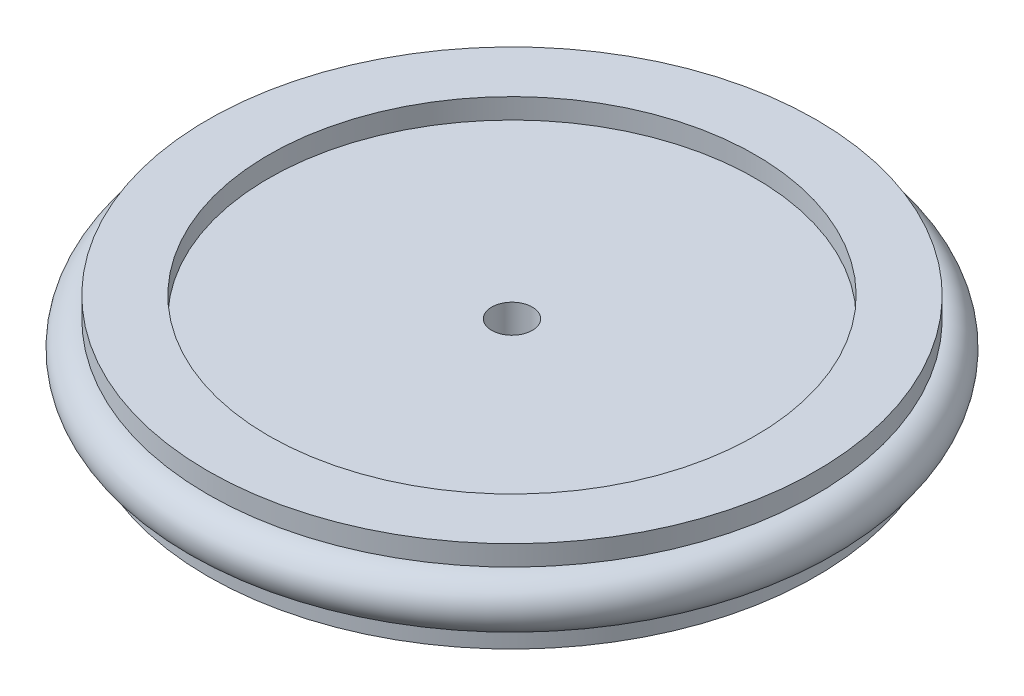
ISO-10303-21;
HEADER;
FILE_DESCRIPTION(('STEP AP214'),'2;1');
FILE_NAME('part.step','',(''),(''),'','','');
FILE_SCHEMA(('AUTOMOTIVE_DESIGN { 1 0 10303 214 1 1 1 1 }'));
ENDSEC;
DATA;
#1=APPLICATION_CONTEXT('core data for automotive mechanical design processes');
#2=APPLICATION_PROTOCOL_DEFINITION('international standard','automotive_design',2000,#1);
#3=PRODUCT_CONTEXT('',#1,'mechanical');
#4=PRODUCT('Part','Part','',(#3));
#5=PRODUCT_RELATED_PRODUCT_CATEGORY('part','',(#4));
#6=PRODUCT_DEFINITION_FORMATION('','',#4);
#7=PRODUCT_DEFINITION_CONTEXT('part definition',#1,'design');
#8=PRODUCT_DEFINITION('design','',#6,#7);
#9=PRODUCT_DEFINITION_SHAPE('','',#8);
#10=(LENGTH_UNIT() NAMED_UNIT(*) SI_UNIT(.MILLI.,.METRE.));
#11=(NAMED_UNIT(*) PLANE_ANGLE_UNIT() SI_UNIT($,.RADIAN.));
#12=(NAMED_UNIT(*) SI_UNIT($,.STERADIAN.) SOLID_ANGLE_UNIT());
#13=UNCERTAINTY_MEASURE_WITH_UNIT(LENGTH_MEASURE(1.E-05),#10,'distance_accuracy_value','');
#14=(GEOMETRIC_REPRESENTATION_CONTEXT(3) GLOBAL_UNCERTAINTY_ASSIGNED_CONTEXT((#13)) GLOBAL_UNIT_ASSIGNED_CONTEXT((#10,
#11,#12)) REPRESENTATION_CONTEXT('',''));
#15=CARTESIAN_POINT('',(0.,0.,0.));
#16=DIRECTION('',(0.,0.,1.));
#17=DIRECTION('',(1.,0.,0.));
#18=AXIS2_PLACEMENT_3D('',#15,#16,#17);
#19=CARTESIAN_POINT('',(1.,-2.,0.));
#20=DIRECTION('',(0.,1.,0.));
#21=DIRECTION('',(0.,0.,1.));
#22=AXIS2_PLACEMENT_3D('',#19,#20,#21);
#23=PLANE('',#22);
#24=CARTESIAN_POINT('',(0.,-2.,0.));
#25=DIRECTION('',(0.,1.,0.));
#26=DIRECTION('',(0.,0.,1.));
#27=AXIS2_PLACEMENT_3D('',#24,#25,#26);
#28=CIRCLE('',#27,3.);
#29=CARTESIAN_POINT('',(0.,-2.,3.));
#30=VERTEX_POINT('',#29);
#31=EDGE_CURVE('E10',#30,#30,#28,.T.);
#32=ORIENTED_EDGE('',*,*,#31,.F.);
#33=EDGE_LOOP('',(#32));
#34=FACE_BOUND('',#33,.T.);
#35=CARTESIAN_POINT('',(0.,-2.,0.));
#36=DIRECTION('',(0.,1.,0.));
#37=DIRECTION('',(0.,0.,1.));
#38=AXIS2_PLACEMENT_3D('',#35,#36,#37);
#39=CIRCLE('',#38,1.);
#40=CARTESIAN_POINT('',(0.,-2.,1.));
#41=VERTEX_POINT('',#40);
#42=EDGE_CURVE('E73',#41,#41,#39,.T.);
#43=ORIENTED_EDGE('',*,*,#42,.T.);
#44=EDGE_LOOP('',(#43));
#45=FACE_BOUND('',#44,.T.);
#46=ADVANCED_FACE('F33',(#34,#45),#23,.F.);
#47=CARTESIAN_POINT('',(0.,26.3538012690022,0.));
#48=DIRECTION('',(0.,1.,0.));
#49=DIRECTION('',(0.,0.,1.));
#50=AXIS2_PLACEMENT_3D('',#47,#48,#49);
#51=CYLINDRICAL_SURFACE('',#50,3.);
#52=CARTESIAN_POINT('',(0.,0.,0.));
#53=DIRECTION('',(0.,1.,0.));
#54=DIRECTION('',(0.,0.,1.));
#55=AXIS2_PLACEMENT_3D('',#52,#53,#54);
#56=CIRCLE('',#55,3.);
#57=CARTESIAN_POINT('',(0.,0.,3.));
#58=VERTEX_POINT('',#57);
#59=EDGE_CURVE('E39',#58,#58,#56,.T.);
#60=ORIENTED_EDGE('',*,*,#59,.F.);
#61=EDGE_LOOP('',(#60));
#62=FACE_BOUND('',#61,.T.);
#63=ORIENTED_EDGE('',*,*,#31,.T.);
#64=EDGE_LOOP('',(#63));
#65=FACE_BOUND('',#64,.T.);
#66=ADVANCED_FACE('F134',(#62,#65),#51,.T.);
#67=CARTESIAN_POINT('',(3.,0.,0.));
#68=DIRECTION('',(0.,1.,0.));
#69=DIRECTION('',(0.,0.,1.));
#70=AXIS2_PLACEMENT_3D('',#67,#68,#69);
#71=PLANE('',#70);
#72=CARTESIAN_POINT('',(0.,0.,0.));
#73=DIRECTION('',(0.,1.,0.));
#74=DIRECTION('',(0.,0.,1.));
#75=AXIS2_PLACEMENT_3D('',#72,#73,#74);
#76=CIRCLE('',#75,12.);
#77=CARTESIAN_POINT('',(0.,0.,12.));
#78=VERTEX_POINT('',#77);
#79=EDGE_CURVE('E43',#78,#78,#76,.T.);
#80=ORIENTED_EDGE('',*,*,#79,.F.);
#81=EDGE_LOOP('',(#80));
#82=FACE_BOUND('',#81,.T.);
#83=ORIENTED_EDGE('',*,*,#59,.T.);
#84=EDGE_LOOP('',(#83));
#85=FACE_BOUND('',#84,.T.);
#86=ADVANCED_FACE('F129',(#82,#85),#71,.F.);
#87=CARTESIAN_POINT('',(0.,26.3538012690022,0.));
#88=DIRECTION('',(0.,1.,0.));
#89=DIRECTION('',(0.,0.,1.));
#90=AXIS2_PLACEMENT_3D('',#87,#88,#89);
#91=CYLINDRICAL_SURFACE('',#90,12.);
#92=CARTESIAN_POINT('',(0.,-1.,0.));
#93=DIRECTION('',(0.,1.,0.));
#94=DIRECTION('',(0.,0.,1.));
#95=AXIS2_PLACEMENT_3D('',#92,#93,#94);
#96=CIRCLE('',#95,12.);
#97=CARTESIAN_POINT('',(0.,-1.,12.));
#98=VERTEX_POINT('',#97);
#99=EDGE_CURVE('E47',#98,#98,#96,.T.);
#100=ORIENTED_EDGE('',*,*,#99,.F.);
#101=EDGE_LOOP('',(#100));
#102=FACE_BOUND('',#101,.T.);
#103=ORIENTED_EDGE('',*,*,#79,.T.);
#104=EDGE_LOOP('',(#103));
#105=FACE_BOUND('',#104,.T.);
#106=ADVANCED_FACE('F123',(#102,#105),#91,.F.);
#107=CARTESIAN_POINT('',(12.,-1.,0.));
#108=DIRECTION('',(0.,1.,0.));
#109=DIRECTION('',(0.,0.,1.));
#110=AXIS2_PLACEMENT_3D('',#107,#108,#109);
#111=PLANE('',#110);
#112=CARTESIAN_POINT('',(0.,-1.,0.));
#113=DIRECTION('',(0.,1.,0.));
#114=DIRECTION('',(0.,0.,1.));
#115=AXIS2_PLACEMENT_3D('',#112,#113,#114);
#116=CIRCLE('',#115,15.);
#117=CARTESIAN_POINT('',(0.,-1.,15.));
#118=VERTEX_POINT('',#117);
#119=EDGE_CURVE('E52',#118,#118,#116,.T.);
#120=ORIENTED_EDGE('',*,*,#119,.F.);
#121=EDGE_LOOP('',(#120));
#122=FACE_BOUND('',#121,.T.);
#123=ORIENTED_EDGE('',*,*,#99,.T.);
#124=EDGE_LOOP('',(#123));
#125=FACE_BOUND('',#124,.T.);
#126=ADVANCED_FACE('F117',(#122,#125),#111,.F.);
#127=CARTESIAN_POINT('',(0.,26.3538012690022,0.));
#128=DIRECTION('',(0.,1.,0.));
#129=DIRECTION('',(0.,0.,1.));
#130=AXIS2_PLACEMENT_3D('',#127,#128,#129);
#131=CYLINDRICAL_SURFACE('',#130,15.);
#132=CARTESIAN_POINT('',(0.,0.,0.));
#133=DIRECTION('',(0.,1.,0.));
#134=DIRECTION('',(0.,0.,1.));
#135=AXIS2_PLACEMENT_3D('',#132,#133,#134);
#136=CIRCLE('',#135,15.);
#137=CARTESIAN_POINT('',(0.,0.,15.));
#138=VERTEX_POINT('',#137);
#139=EDGE_CURVE('E55',#138,#138,#136,.T.);
#140=ORIENTED_EDGE('',*,*,#139,.F.);
#141=EDGE_LOOP('',(#140));
#142=FACE_BOUND('',#141,.T.);
#143=ORIENTED_EDGE('',*,*,#119,.T.);
#144=EDGE_LOOP('',(#143));
#145=FACE_BOUND('',#144,.T.);
#146=ADVANCED_FACE('F111',(#142,#145),#131,.T.);
#147=CARTESIAN_POINT('',(0.,1.25,0.));
#148=DIRECTION('',(0.,1.,0.));
#149=DIRECTION('',(0.,0.,1.));
#150=AXIS2_PLACEMENT_3D('',#147,#148,#149);
#151=TOROIDAL_SURFACE('',#150,15.,1.25);
#152=CARTESIAN_POINT('',(0.,2.5,0.));
#153=DIRECTION('',(0.,1.,0.));
#154=DIRECTION('',(0.,0.,1.));
#155=AXIS2_PLACEMENT_3D('',#152,#153,#154);
#156=CIRCLE('',#155,15.);
#157=CARTESIAN_POINT('',(0.,2.5,15.));
#158=VERTEX_POINT('',#157);
#159=EDGE_CURVE('E58',#158,#158,#156,.T.);
#160=ORIENTED_EDGE('',*,*,#159,.F.);
#161=EDGE_LOOP('',(#160));
#162=FACE_BOUND('',#161,.T.);
#163=ORIENTED_EDGE('',*,*,#139,.T.);
#164=EDGE_LOOP('',(#163));
#165=FACE_BOUND('',#164,.T.);
#166=ADVANCED_FACE('F105',(#162,#165),#151,.T.);
#167=CARTESIAN_POINT('',(0.,26.3538012690022,0.));
#168=DIRECTION('',(0.,1.,0.));
#169=DIRECTION('',(0.,0.,1.));
#170=AXIS2_PLACEMENT_3D('',#167,#168,#169);
#171=CYLINDRICAL_SURFACE('',#170,15.);
#172=CARTESIAN_POINT('',(0.,3.5,0.));
#173=DIRECTION('',(0.,1.,0.));
#174=DIRECTION('',(0.,0.,1.));
#175=AXIS2_PLACEMENT_3D('',#172,#173,#174);
#176=CIRCLE('',#175,15.);
#177=CARTESIAN_POINT('',(0.,3.5,15.));
#178=VERTEX_POINT('',#177);
#179=EDGE_CURVE('E61',#178,#178,#176,.T.);
#180=ORIENTED_EDGE('',*,*,#179,.F.);
#181=EDGE_LOOP('',(#180));
#182=FACE_BOUND('',#181,.T.);
#183=ORIENTED_EDGE('',*,*,#159,.T.);
#184=EDGE_LOOP('',(#183));
#185=FACE_BOUND('',#184,.T.);
#186=ADVANCED_FACE('F99',(#182,#185),#171,.T.);
#187=CARTESIAN_POINT('',(15.,3.5,0.));
#188=DIRECTION('',(0.,-1.,0.));
#189=DIRECTION('',(0.,0.,-1.));
#190=AXIS2_PLACEMENT_3D('',#187,#188,#189);
#191=PLANE('',#190);
#192=CARTESIAN_POINT('',(0.,3.5,0.));
#193=DIRECTION('',(0.,1.,0.));
#194=DIRECTION('',(0.,0.,1.));
#195=AXIS2_PLACEMENT_3D('',#192,#193,#194);
#196=CIRCLE('',#195,12.);
#197=CARTESIAN_POINT('',(0.,3.5,12.));
#198=VERTEX_POINT('',#197);
#199=EDGE_CURVE('E64',#198,#198,#196,.T.);
#200=ORIENTED_EDGE('',*,*,#199,.F.);
#201=EDGE_LOOP('',(#200));
#202=FACE_BOUND('',#201,.T.);
#203=ORIENTED_EDGE('',*,*,#179,.T.);
#204=EDGE_LOOP('',(#203));
#205=FACE_BOUND('',#204,.T.);
#206=ADVANCED_FACE('F93',(#202,#205),#191,.F.);
#207=CARTESIAN_POINT('',(0.,26.3538012690022,0.));
#208=DIRECTION('',(0.,1.,0.));
#209=DIRECTION('',(0.,0.,1.));
#210=AXIS2_PLACEMENT_3D('',#207,#208,#209);
#211=CYLINDRICAL_SURFACE('',#210,12.);
#212=CARTESIAN_POINT('',(0.,2.5,0.));
#213=DIRECTION('',(0.,1.,0.));
#214=DIRECTION('',(0.,0.,1.));
#215=AXIS2_PLACEMENT_3D('',#212,#213,#214);
#216=CIRCLE('',#215,12.);
#217=CARTESIAN_POINT('',(0.,2.5,12.));
#218=VERTEX_POINT('',#217);
#219=EDGE_CURVE('E67',#218,#218,#216,.T.);
#220=ORIENTED_EDGE('',*,*,#219,.F.);
#221=EDGE_LOOP('',(#220));
#222=FACE_BOUND('',#221,.T.);
#223=ORIENTED_EDGE('',*,*,#199,.T.);
#224=EDGE_LOOP('',(#223));
#225=FACE_BOUND('',#224,.T.);
#226=ADVANCED_FACE('F87',(#222,#225),#211,.F.);
#227=CARTESIAN_POINT('',(12.,2.5,0.));
#228=DIRECTION('',(0.,-1.,0.));
#229=DIRECTION('',(0.,0.,-1.));
#230=AXIS2_PLACEMENT_3D('',#227,#228,#229);
#231=PLANE('',#230);
#232=CARTESIAN_POINT('',(0.,2.5,0.));
#233=DIRECTION('',(0.,1.,0.));
#234=DIRECTION('',(0.,0.,1.));
#235=AXIS2_PLACEMENT_3D('',#232,#233,#234);
#236=CIRCLE('',#235,1.);
#237=CARTESIAN_POINT('',(0.,2.5,1.));
#238=VERTEX_POINT('',#237);
#239=EDGE_CURVE('E70',#238,#238,#236,.T.);
#240=ORIENTED_EDGE('',*,*,#239,.F.);
#241=EDGE_LOOP('',(#240));
#242=FACE_BOUND('',#241,.T.);
#243=ORIENTED_EDGE('',*,*,#219,.T.);
#244=EDGE_LOOP('',(#243));
#245=FACE_BOUND('',#244,.T.);
#246=ADVANCED_FACE('F81',(#242,#245),#231,.F.);
#247=CARTESIAN_POINT('',(0.,26.3538012690022,0.));
#248=DIRECTION('',(0.,1.,0.));
#249=DIRECTION('',(0.,0.,1.));
#250=AXIS2_PLACEMENT_3D('',#247,#248,#249);
#251=CYLINDRICAL_SURFACE('',#250,1.);
#252=ORIENTED_EDGE('',*,*,#42,.F.);
#253=EDGE_LOOP('',(#252));
#254=FACE_BOUND('',#253,.T.);
#255=ORIENTED_EDGE('',*,*,#239,.T.);
#256=EDGE_LOOP('',(#255));
#257=FACE_BOUND('',#256,.T.);
#258=ADVANCED_FACE('F78',(#254,#257),#251,.F.);
#259=CLOSED_SHELL('',(#46,#66,#86,#106,#126,#146,#166,#186,#206,#226,#246,#258));
#260=MANIFOLD_SOLID_BREP('B2',#259);
#261=ADVANCED_BREP_SHAPE_REPRESENTATION('',(#18,#260),#14);
#262=SHAPE_DEFINITION_REPRESENTATION(#9,#261);
ENDSEC;
END-ISO-10303-21;
